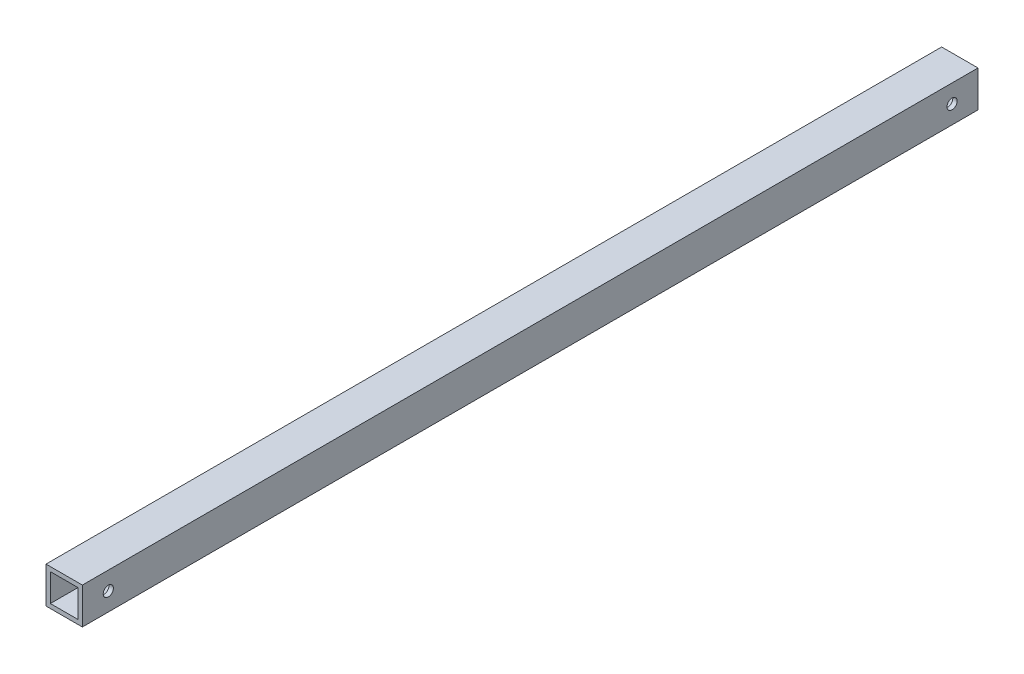
ISO-10303-21;
HEADER;
FILE_DESCRIPTION(('STEP AP214'),'2;1');
FILE_NAME('part.step','',(''),(''),'','','');
FILE_SCHEMA(('AUTOMOTIVE_DESIGN { 1 0 10303 214 1 1 1 1 }'));
ENDSEC;
DATA;
#1=APPLICATION_CONTEXT('core data for automotive mechanical design processes');
#2=APPLICATION_PROTOCOL_DEFINITION('international standard','automotive_design',2000,#1);
#3=PRODUCT_CONTEXT('',#1,'mechanical');
#4=PRODUCT('Part','Part','',(#3));
#5=PRODUCT_RELATED_PRODUCT_CATEGORY('part','',(#4));
#6=PRODUCT_DEFINITION_FORMATION('','',#4);
#7=PRODUCT_DEFINITION_CONTEXT('part definition',#1,'design');
#8=PRODUCT_DEFINITION('design','',#6,#7);
#9=PRODUCT_DEFINITION_SHAPE('','',#8);
#10=(LENGTH_UNIT() NAMED_UNIT(*) SI_UNIT(.MILLI.,.METRE.));
#11=(NAMED_UNIT(*) PLANE_ANGLE_UNIT() SI_UNIT($,.RADIAN.));
#12=(NAMED_UNIT(*) SI_UNIT($,.STERADIAN.) SOLID_ANGLE_UNIT());
#13=UNCERTAINTY_MEASURE_WITH_UNIT(LENGTH_MEASURE(1.E-05),#10,'distance_accuracy_value','');
#14=(GEOMETRIC_REPRESENTATION_CONTEXT(3) GLOBAL_UNCERTAINTY_ASSIGNED_CONTEXT((#13)) GLOBAL_UNIT_ASSIGNED_CONTEXT((#10,
#11,#12)) REPRESENTATION_CONTEXT('',''));
#15=CARTESIAN_POINT('',(0.,0.,0.));
#16=DIRECTION('',(0.,0.,1.));
#17=DIRECTION('',(1.,0.,0.));
#18=AXIS2_PLACEMENT_3D('',#15,#16,#17);
#19=CARTESIAN_POINT('',(0.,-25.,616.));
#20=DIRECTION('',(0.,0.,1.));
#21=DIRECTION('',(1.,0.,0.));
#22=AXIS2_PLACEMENT_3D('',#19,#20,#21);
#23=PLANE('',#22);
#24=DIRECTION('',(0.,-1.,0.));
#25=VECTOR('',#24,1.);
#26=CARTESIAN_POINT('',(0.,0.,616.));
#27=LINE('',#26,#25);
#28=CARTESIAN_POINT('',(0.,0.,616.));
#29=VERTEX_POINT('',#28);
#30=CARTESIAN_POINT('',(0.,-25.,616.));
#31=VERTEX_POINT('',#30);
#32=EDGE_CURVE('E139',#29,#31,#27,.T.);
#33=ORIENTED_EDGE('',*,*,#32,.T.);
#34=DIRECTION('',(1.,0.,0.));
#35=VECTOR('',#34,1.);
#36=CARTESIAN_POINT('',(0.,-25.,616.));
#37=LINE('',#36,#35);
#38=CARTESIAN_POINT('',(25.,-25.,616.));
#39=VERTEX_POINT('',#38);
#40=EDGE_CURVE('E142',#31,#39,#37,.T.);
#41=ORIENTED_EDGE('',*,*,#40,.T.);
#42=DIRECTION('',(0.,1.,0.));
#43=VECTOR('',#42,1.);
#44=CARTESIAN_POINT('',(25.,0.,616.));
#45=LINE('',#44,#43);
#46=CARTESIAN_POINT('',(25.,0.,616.));
#47=VERTEX_POINT('',#46);
#48=EDGE_CURVE('E145',#39,#47,#45,.T.);
#49=ORIENTED_EDGE('',*,*,#48,.T.);
#50=DIRECTION('',(-1.,0.,0.));
#51=VECTOR('',#50,1.);
#52=CARTESIAN_POINT('',(0.,0.,616.));
#53=LINE('',#52,#51);
#54=EDGE_CURVE('E147',#47,#29,#53,.T.);
#55=ORIENTED_EDGE('',*,*,#54,.T.);
#56=EDGE_LOOP('',(#33,#41,#49,#55));
#57=FACE_BOUND('',#56,.T.);
#58=DIRECTION('',(1.,0.,0.));
#59=VECTOR('',#58,1.);
#60=CARTESIAN_POINT('',(3.,-22.,616.));
#61=LINE('',#60,#59);
#62=CARTESIAN_POINT('',(3.,-22.,616.));
#63=VERTEX_POINT('',#62);
#64=CARTESIAN_POINT('',(22.,-22.,616.));
#65=VERTEX_POINT('',#64);
#66=EDGE_CURVE('E109',#63,#65,#61,.T.);
#67=ORIENTED_EDGE('',*,*,#66,.F.);
#68=DIRECTION('',(0.,-1.,0.));
#69=VECTOR('',#68,1.);
#70=CARTESIAN_POINT('',(3.,-3.,616.));
#71=LINE('',#70,#69);
#72=CARTESIAN_POINT('',(3.,-3.,616.));
#73=VERTEX_POINT('',#72);
#74=EDGE_CURVE('E101',#73,#63,#71,.T.);
#75=ORIENTED_EDGE('',*,*,#74,.F.);
#76=DIRECTION('',(-1.,0.,0.));
#77=VECTOR('',#76,1.);
#78=CARTESIAN_POINT('',(3.,-3.,616.));
#79=LINE('',#78,#77);
#80=CARTESIAN_POINT('',(22.,-3.,616.));
#81=VERTEX_POINT('',#80);
#82=EDGE_CURVE('E123',#81,#73,#79,.T.);
#83=ORIENTED_EDGE('',*,*,#82,.F.);
#84=DIRECTION('',(0.,1.,0.));
#85=VECTOR('',#84,1.);
#86=CARTESIAN_POINT('',(22.,-3.,616.));
#87=LINE('',#86,#85);
#88=EDGE_CURVE('E121',#65,#81,#87,.T.);
#89=ORIENTED_EDGE('',*,*,#88,.F.);
#90=EDGE_LOOP('',(#67,#75,#83,#89));
#91=FACE_BOUND('',#90,.T.);
#92=ADVANCED_FACE('F35',(#57,#91),#23,.T.);
#93=CARTESIAN_POINT('',(0.,-25.,0.));
#94=DIRECTION('',(0.,0.,1.));
#95=DIRECTION('',(1.,0.,0.));
#96=AXIS2_PLACEMENT_3D('',#93,#94,#95);
#97=PLANE('',#96);
#98=DIRECTION('',(0.,-1.,0.));
#99=VECTOR('',#98,1.);
#100=CARTESIAN_POINT('',(0.,0.,0.));
#101=LINE('',#100,#99);
#102=CARTESIAN_POINT('',(0.,0.,0.));
#103=VERTEX_POINT('',#102);
#104=CARTESIAN_POINT('',(0.,-25.,0.));
#105=VERTEX_POINT('',#104);
#106=EDGE_CURVE('E117',#103,#105,#101,.T.);
#107=ORIENTED_EDGE('',*,*,#106,.F.);
#108=DIRECTION('',(-1.,0.,0.));
#109=VECTOR('',#108,1.);
#110=CARTESIAN_POINT('',(0.,0.,0.));
#111=LINE('',#110,#109);
#112=CARTESIAN_POINT('',(25.,0.,0.));
#113=VERTEX_POINT('',#112);
#114=EDGE_CURVE('E143',#113,#103,#111,.T.);
#115=ORIENTED_EDGE('',*,*,#114,.F.);
#116=DIRECTION('',(0.,1.,0.));
#117=VECTOR('',#116,1.);
#118=CARTESIAN_POINT('',(25.,0.,0.));
#119=LINE('',#118,#117);
#120=CARTESIAN_POINT('',(25.,-25.,0.));
#121=VERTEX_POINT('',#120);
#122=EDGE_CURVE('E154',#121,#113,#119,.T.);
#123=ORIENTED_EDGE('',*,*,#122,.F.);
#124=DIRECTION('',(1.,0.,0.));
#125=VECTOR('',#124,1.);
#126=CARTESIAN_POINT('',(0.,-25.,0.));
#127=LINE('',#126,#125);
#128=EDGE_CURVE('E152',#105,#121,#127,.T.);
#129=ORIENTED_EDGE('',*,*,#128,.F.);
#130=EDGE_LOOP('',(#107,#115,#123,#129));
#131=FACE_BOUND('',#130,.T.);
#132=DIRECTION('',(0.,-1.,0.));
#133=VECTOR('',#132,1.);
#134=CARTESIAN_POINT('',(3.,-3.,0.));
#135=LINE('',#134,#133);
#136=CARTESIAN_POINT('',(3.,-3.,0.));
#137=VERTEX_POINT('',#136);
#138=CARTESIAN_POINT('',(3.,-22.,0.));
#139=VERTEX_POINT('',#138);
#140=EDGE_CURVE('E59',#137,#139,#135,.T.);
#141=ORIENTED_EDGE('',*,*,#140,.T.);
#142=DIRECTION('',(1.,0.,0.));
#143=VECTOR('',#142,1.);
#144=CARTESIAN_POINT('',(3.,-22.,0.));
#145=LINE('',#144,#143);
#146=CARTESIAN_POINT('',(22.,-22.,0.));
#147=VERTEX_POINT('',#146);
#148=EDGE_CURVE('E116',#139,#147,#145,.T.);
#149=ORIENTED_EDGE('',*,*,#148,.T.);
#150=DIRECTION('',(0.,1.,0.));
#151=VECTOR('',#150,1.);
#152=CARTESIAN_POINT('',(22.,-3.,0.));
#153=LINE('',#152,#151);
#154=CARTESIAN_POINT('',(22.,-3.,0.));
#155=VERTEX_POINT('',#154);
#156=EDGE_CURVE('E131',#147,#155,#153,.T.);
#157=ORIENTED_EDGE('',*,*,#156,.T.);
#158=DIRECTION('',(-1.,0.,0.));
#159=VECTOR('',#158,1.);
#160=CARTESIAN_POINT('',(3.,-3.,0.));
#161=LINE('',#160,#159);
#162=EDGE_CURVE('E110',#155,#137,#161,.T.);
#163=ORIENTED_EDGE('',*,*,#162,.T.);
#164=EDGE_LOOP('',(#141,#149,#157,#163));
#165=FACE_BOUND('',#164,.T.);
#166=ADVANCED_FACE('F173',(#131,#165),#97,.F.);
#167=CARTESIAN_POINT('',(0.,0.,616.));
#168=DIRECTION('',(1.,0.,0.));
#169=DIRECTION('',(0.,1.,0.));
#170=AXIS2_PLACEMENT_3D('',#167,#168,#169);
#171=PLANE('',#170);
#172=CARTESIAN_POINT('',(0.,-12.5,17.85));
#173=DIRECTION('',(1.,0.,0.));
#174=DIRECTION('',(0.,0.,-1.));
#175=AXIS2_PLACEMENT_3D('',#172,#173,#174);
#176=CIRCLE('',#175,3.49999999999999);
#177=CARTESIAN_POINT('',(0.,-12.5,14.35));
#178=VERTEX_POINT('',#177);
#179=EDGE_CURVE('E233',#178,#178,#176,.T.);
#180=ORIENTED_EDGE('',*,*,#179,.T.);
#181=EDGE_LOOP('',(#180));
#182=FACE_BOUND('',#181,.T.);
#183=CARTESIAN_POINT('',(0.,-12.5,598.15));
#184=DIRECTION('',(1.,0.,0.));
#185=DIRECTION('',(0.,0.,-1.));
#186=AXIS2_PLACEMENT_3D('',#183,#184,#185);
#187=CIRCLE('',#186,3.49999999999999);
#188=CARTESIAN_POINT('',(0.,-12.5,594.65));
#189=VERTEX_POINT('',#188);
#190=EDGE_CURVE('E217',#189,#189,#187,.T.);
#191=ORIENTED_EDGE('',*,*,#190,.T.);
#192=EDGE_LOOP('',(#191));
#193=FACE_BOUND('',#192,.T.);
#194=ORIENTED_EDGE('',*,*,#106,.T.);
#195=DIRECTION('',(0.,0.,-1.));
#196=VECTOR('',#195,1.);
#197=CARTESIAN_POINT('',(0.,-25.,616.));
#198=LINE('',#197,#196);
#199=EDGE_CURVE('E11',#31,#105,#198,.T.);
#200=ORIENTED_EDGE('',*,*,#199,.F.);
#201=ORIENTED_EDGE('',*,*,#32,.F.);
#202=DIRECTION('',(0.,0.,-1.));
#203=VECTOR('',#202,1.);
#204=CARTESIAN_POINT('',(0.,0.,616.));
#205=LINE('',#204,#203);
#206=EDGE_CURVE('E149',#29,#103,#205,.T.);
#207=ORIENTED_EDGE('',*,*,#206,.T.);
#208=EDGE_LOOP('',(#194,#200,#201,#207));
#209=FACE_BOUND('',#208,.T.);
#210=ADVANCED_FACE('F37',(#182,#193,#209),#171,.F.);
#211=CARTESIAN_POINT('',(0.,-25.,616.));
#212=DIRECTION('',(0.,1.,0.));
#213=DIRECTION('',(0.,0.,1.));
#214=AXIS2_PLACEMENT_3D('',#211,#212,#213);
#215=PLANE('',#214);
#216=ORIENTED_EDGE('',*,*,#128,.T.);
#217=DIRECTION('',(0.,0.,-1.));
#218=VECTOR('',#217,1.);
#219=CARTESIAN_POINT('',(25.,-25.,616.));
#220=LINE('',#219,#218);
#221=EDGE_CURVE('E44',#39,#121,#220,.T.);
#222=ORIENTED_EDGE('',*,*,#221,.F.);
#223=ORIENTED_EDGE('',*,*,#40,.F.);
#224=ORIENTED_EDGE('',*,*,#199,.T.);
#225=EDGE_LOOP('',(#216,#222,#223,#224));
#226=FACE_BOUND('',#225,.T.);
#227=ADVANCED_FACE('F183',(#226),#215,.F.);
#228=CARTESIAN_POINT('',(25.,0.,616.));
#229=DIRECTION('',(-1.,0.,0.));
#230=DIRECTION('',(0.,-1.,0.));
#231=AXIS2_PLACEMENT_3D('',#228,#229,#230);
#232=PLANE('',#231);
#233=CARTESIAN_POINT('',(25.,-12.5,17.85));
#234=DIRECTION('',(1.,0.,0.));
#235=DIRECTION('',(0.,0.,-1.));
#236=AXIS2_PLACEMENT_3D('',#233,#234,#235);
#237=CIRCLE('',#236,3.5);
#238=CARTESIAN_POINT('',(25.,-12.5,14.35));
#239=VERTEX_POINT('',#238);
#240=EDGE_CURVE('E225',#239,#239,#237,.T.);
#241=ORIENTED_EDGE('',*,*,#240,.F.);
#242=EDGE_LOOP('',(#241));
#243=FACE_BOUND('',#242,.T.);
#244=CARTESIAN_POINT('',(25.,-12.5,598.15));
#245=DIRECTION('',(1.,0.,0.));
#246=DIRECTION('',(0.,0.,-1.));
#247=AXIS2_PLACEMENT_3D('',#244,#245,#246);
#248=CIRCLE('',#247,3.5);
#249=CARTESIAN_POINT('',(25.,-12.5,594.65));
#250=VERTEX_POINT('',#249);
#251=EDGE_CURVE('E220',#250,#250,#248,.T.);
#252=ORIENTED_EDGE('',*,*,#251,.F.);
#253=EDGE_LOOP('',(#252));
#254=FACE_BOUND('',#253,.T.);
#255=ORIENTED_EDGE('',*,*,#122,.T.);
#256=DIRECTION('',(0.,0.,-1.));
#257=VECTOR('',#256,1.);
#258=CARTESIAN_POINT('',(25.,0.,616.));
#259=LINE('',#258,#257);
#260=EDGE_CURVE('E159',#47,#113,#259,.T.);
#261=ORIENTED_EDGE('',*,*,#260,.F.);
#262=ORIENTED_EDGE('',*,*,#48,.F.);
#263=ORIENTED_EDGE('',*,*,#221,.T.);
#264=EDGE_LOOP('',(#255,#261,#262,#263));
#265=FACE_BOUND('',#264,.T.);
#266=ADVANCED_FACE('F167',(#243,#254,#265),#232,.F.);
#267=CARTESIAN_POINT('',(0.,0.,616.));
#268=DIRECTION('',(0.,-1.,0.));
#269=DIRECTION('',(0.,0.,-1.));
#270=AXIS2_PLACEMENT_3D('',#267,#268,#269);
#271=PLANE('',#270);
#272=ORIENTED_EDGE('',*,*,#114,.T.);
#273=ORIENTED_EDGE('',*,*,#206,.F.);
#274=ORIENTED_EDGE('',*,*,#54,.F.);
#275=ORIENTED_EDGE('',*,*,#260,.T.);
#276=EDGE_LOOP('',(#272,#273,#274,#275));
#277=FACE_BOUND('',#276,.T.);
#278=ADVANCED_FACE('F177',(#277),#271,.F.);
#279=CARTESIAN_POINT('',(3.,-3.,616.));
#280=DIRECTION('',(1.,0.,0.));
#281=DIRECTION('',(0.,1.,0.));
#282=AXIS2_PLACEMENT_3D('',#279,#280,#281);
#283=PLANE('',#282);
#284=CARTESIAN_POINT('',(3.,-12.5,17.85));
#285=DIRECTION('',(1.,0.,0.));
#286=DIRECTION('',(0.,1.,0.));
#287=AXIS2_PLACEMENT_3D('',#284,#285,#286);
#288=CIRCLE('',#287,3.5);
#289=CARTESIAN_POINT('',(3.,-9.00000000000001,17.85));
#290=VERTEX_POINT('',#289);
#291=EDGE_CURVE('E213',#290,#290,#288,.T.);
#292=ORIENTED_EDGE('',*,*,#291,.F.);
#293=EDGE_LOOP('',(#292));
#294=FACE_BOUND('',#293,.T.);
#295=CARTESIAN_POINT('',(3.,-12.5,598.15));
#296=DIRECTION('',(1.,0.,0.));
#297=DIRECTION('',(0.,1.,0.));
#298=AXIS2_PLACEMENT_3D('',#295,#296,#297);
#299=CIRCLE('',#298,3.5);
#300=CARTESIAN_POINT('',(3.,-9.00000000000001,598.15));
#301=VERTEX_POINT('',#300);
#302=EDGE_CURVE('E39',#301,#301,#299,.T.);
#303=ORIENTED_EDGE('',*,*,#302,.F.);
#304=EDGE_LOOP('',(#303));
#305=FACE_BOUND('',#304,.T.);
#306=ORIENTED_EDGE('',*,*,#140,.F.);
#307=DIRECTION('',(0.,0.,-1.));
#308=VECTOR('',#307,1.);
#309=CARTESIAN_POINT('',(3.,-3.,616.));
#310=LINE('',#309,#308);
#311=EDGE_CURVE('E105',#73,#137,#310,.T.);
#312=ORIENTED_EDGE('',*,*,#311,.F.);
#313=ORIENTED_EDGE('',*,*,#74,.T.);
#314=DIRECTION('',(0.,0.,-1.));
#315=VECTOR('',#314,1.);
#316=CARTESIAN_POINT('',(3.,-22.,616.));
#317=LINE('',#316,#315);
#318=EDGE_CURVE('E104',#63,#139,#317,.T.);
#319=ORIENTED_EDGE('',*,*,#318,.T.);
#320=EDGE_LOOP('',(#306,#312,#313,#319));
#321=FACE_BOUND('',#320,.T.);
#322=ADVANCED_FACE('F103',(#294,#305,#321),#283,.T.);
#323=CARTESIAN_POINT('',(3.,-22.,616.));
#324=DIRECTION('',(0.,1.,0.));
#325=DIRECTION('',(0.,0.,1.));
#326=AXIS2_PLACEMENT_3D('',#323,#324,#325);
#327=PLANE('',#326);
#328=ORIENTED_EDGE('',*,*,#148,.F.);
#329=ORIENTED_EDGE('',*,*,#318,.F.);
#330=ORIENTED_EDGE('',*,*,#66,.T.);
#331=DIRECTION('',(0.,0.,-1.));
#332=VECTOR('',#331,1.);
#333=CARTESIAN_POINT('',(22.,-22.,616.));
#334=LINE('',#333,#332);
#335=EDGE_CURVE('E118',#65,#147,#334,.T.);
#336=ORIENTED_EDGE('',*,*,#335,.T.);
#337=EDGE_LOOP('',(#328,#329,#330,#336));
#338=FACE_BOUND('',#337,.T.);
#339=ADVANCED_FACE('F113',(#338),#327,.T.);
#340=CARTESIAN_POINT('',(22.,-3.,616.));
#341=DIRECTION('',(-1.,0.,0.));
#342=DIRECTION('',(0.,-1.,0.));
#343=AXIS2_PLACEMENT_3D('',#340,#341,#342);
#344=PLANE('',#343);
#345=CARTESIAN_POINT('',(22.,-12.5,17.85));
#346=DIRECTION('',(-1.,0.,0.));
#347=DIRECTION('',(0.,-1.,0.));
#348=AXIS2_PLACEMENT_3D('',#345,#346,#347);
#349=CIRCLE('',#348,3.5);
#350=CARTESIAN_POINT('',(22.,-16.,17.85));
#351=VERTEX_POINT('',#350);
#352=EDGE_CURVE('E230',#351,#351,#349,.T.);
#353=ORIENTED_EDGE('',*,*,#352,.F.);
#354=EDGE_LOOP('',(#353));
#355=FACE_BOUND('',#354,.T.);
#356=CARTESIAN_POINT('',(22.,-12.5,598.15));
#357=DIRECTION('',(-1.,0.,0.));
#358=DIRECTION('',(0.,-1.,0.));
#359=AXIS2_PLACEMENT_3D('',#356,#357,#358);
#360=CIRCLE('',#359,3.5);
#361=CARTESIAN_POINT('',(22.,-16.,598.15));
#362=VERTEX_POINT('',#361);
#363=EDGE_CURVE('E129',#362,#362,#360,.T.);
#364=ORIENTED_EDGE('',*,*,#363,.F.);
#365=EDGE_LOOP('',(#364));
#366=FACE_BOUND('',#365,.T.);
#367=ORIENTED_EDGE('',*,*,#156,.F.);
#368=ORIENTED_EDGE('',*,*,#335,.F.);
#369=ORIENTED_EDGE('',*,*,#88,.T.);
#370=DIRECTION('',(0.,0.,-1.));
#371=VECTOR('',#370,1.);
#372=CARTESIAN_POINT('',(22.,-3.,616.));
#373=LINE('',#372,#371);
#374=EDGE_CURVE('E51',#81,#155,#373,.T.);
#375=ORIENTED_EDGE('',*,*,#374,.T.);
#376=EDGE_LOOP('',(#367,#368,#369,#375));
#377=FACE_BOUND('',#376,.T.);
#378=ADVANCED_FACE('F209',(#355,#366,#377),#344,.T.);
#379=CARTESIAN_POINT('',(3.,-3.,616.));
#380=DIRECTION('',(0.,-1.,0.));
#381=DIRECTION('',(0.,0.,-1.));
#382=AXIS2_PLACEMENT_3D('',#379,#380,#381);
#383=PLANE('',#382);
#384=ORIENTED_EDGE('',*,*,#162,.F.);
#385=ORIENTED_EDGE('',*,*,#374,.F.);
#386=ORIENTED_EDGE('',*,*,#82,.T.);
#387=ORIENTED_EDGE('',*,*,#311,.T.);
#388=EDGE_LOOP('',(#384,#385,#386,#387));
#389=FACE_BOUND('',#388,.T.);
#390=ADVANCED_FACE('F253',(#389),#383,.T.);
#391=CARTESIAN_POINT('',(25.,-12.5,598.15));
#392=DIRECTION('',(1.,0.,0.));
#393=DIRECTION('',(0.,0.,-1.));
#394=AXIS2_PLACEMENT_3D('',#391,#392,#393);
#395=CYLINDRICAL_SURFACE('',#394,3.5);
#396=ORIENTED_EDGE('',*,*,#302,.T.);
#397=EDGE_LOOP('',(#396));
#398=FACE_BOUND('',#397,.T.);
#399=ORIENTED_EDGE('',*,*,#190,.F.);
#400=EDGE_LOOP('',(#399));
#401=FACE_BOUND('',#400,.T.);
#402=ADVANCED_FACE('F250',(#398,#401),#395,.F.);
#403=ORIENTED_EDGE('',*,*,#363,.T.);
#404=EDGE_LOOP('',(#403));
#405=FACE_BOUND('',#404,.T.);
#406=ORIENTED_EDGE('',*,*,#251,.T.);
#407=EDGE_LOOP('',(#406));
#408=FACE_BOUND('',#407,.T.);
#409=ADVANCED_FACE('F246',(#405,#408),#395,.F.);
#410=CARTESIAN_POINT('',(25.,-12.5,17.85));
#411=DIRECTION('',(1.,0.,0.));
#412=DIRECTION('',(0.,0.,-1.));
#413=AXIS2_PLACEMENT_3D('',#410,#411,#412);
#414=CYLINDRICAL_SURFACE('',#413,3.5);
#415=ORIENTED_EDGE('',*,*,#352,.T.);
#416=EDGE_LOOP('',(#415));
#417=FACE_BOUND('',#416,.T.);
#418=ORIENTED_EDGE('',*,*,#240,.T.);
#419=EDGE_LOOP('',(#418));
#420=FACE_BOUND('',#419,.T.);
#421=ADVANCED_FACE('F240',(#417,#420),#414,.F.);
#422=CARTESIAN_POINT('',(25.,-12.5,17.85));
#423=DIRECTION('',(1.,0.,0.));
#424=DIRECTION('',(0.,0.,-1.));
#425=AXIS2_PLACEMENT_3D('',#422,#423,#424);
#426=CYLINDRICAL_SURFACE('',#425,3.5);
#427=ORIENTED_EDGE('',*,*,#291,.T.);
#428=EDGE_LOOP('',(#427));
#429=FACE_BOUND('',#428,.T.);
#430=ORIENTED_EDGE('',*,*,#179,.F.);
#431=EDGE_LOOP('',(#430));
#432=FACE_BOUND('',#431,.T.);
#433=ADVANCED_FACE('F237',(#429,#432),#426,.F.);
#434=CLOSED_SHELL('',(#92,#166,#210,#227,#266,#278,#322,#339,#378,#390,#402,#409,#421,#433));
#435=MANIFOLD_SOLID_BREP('B2',#434);
#436=ADVANCED_BREP_SHAPE_REPRESENTATION('',(#18,#435),#14);
#437=SHAPE_DEFINITION_REPRESENTATION(#9,#436);
ENDSEC;
END-ISO-10303-21;
